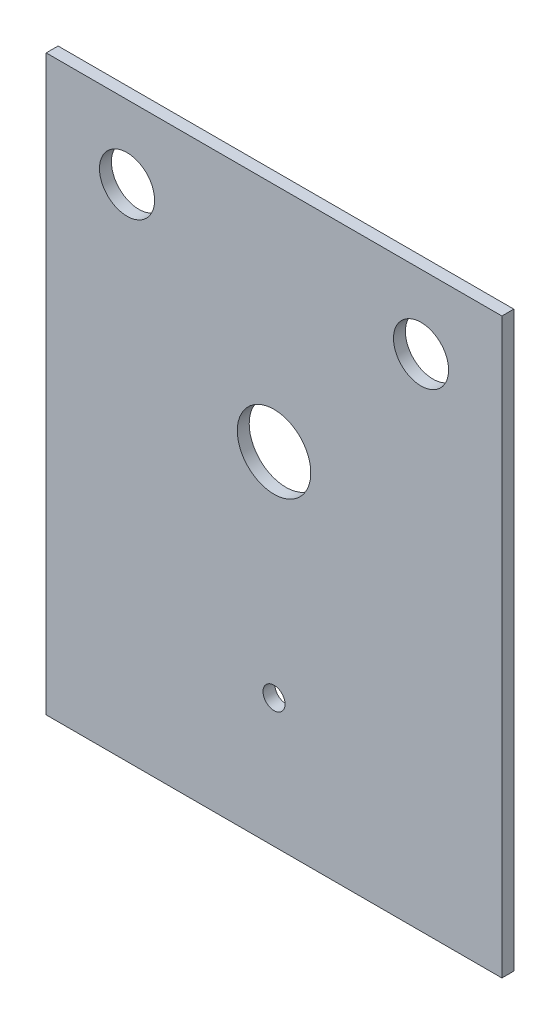
ISO-10303-21;
HEADER;
FILE_DESCRIPTION(('STEP AP214'),'2;1');
FILE_NAME('part.step','',(''),(''),'','','');
FILE_SCHEMA(('AUTOMOTIVE_DESIGN { 1 0 10303 214 1 1 1 1 }'));
ENDSEC;
DATA;
#1=APPLICATION_CONTEXT('core data for automotive mechanical design processes');
#2=APPLICATION_PROTOCOL_DEFINITION('international standard','automotive_design',2000,#1);
#3=PRODUCT_CONTEXT('',#1,'mechanical');
#4=PRODUCT('Part','Part','',(#3));
#5=PRODUCT_RELATED_PRODUCT_CATEGORY('part','',(#4));
#6=PRODUCT_DEFINITION_FORMATION('','',#4);
#7=PRODUCT_DEFINITION_CONTEXT('part definition',#1,'design');
#8=PRODUCT_DEFINITION('design','',#6,#7);
#9=PRODUCT_DEFINITION_SHAPE('','',#8);
#10=(LENGTH_UNIT() NAMED_UNIT(*) SI_UNIT(.MILLI.,.METRE.));
#11=(NAMED_UNIT(*) PLANE_ANGLE_UNIT() SI_UNIT($,.RADIAN.));
#12=(NAMED_UNIT(*) SI_UNIT($,.STERADIAN.) SOLID_ANGLE_UNIT());
#13=UNCERTAINTY_MEASURE_WITH_UNIT(LENGTH_MEASURE(1.E-05),#10,'distance_accuracy_value','');
#14=(GEOMETRIC_REPRESENTATION_CONTEXT(3) GLOBAL_UNCERTAINTY_ASSIGNED_CONTEXT((#13)) GLOBAL_UNIT_ASSIGNED_CONTEXT((#10,
#11,#12)) REPRESENTATION_CONTEXT('',''));
#15=CARTESIAN_POINT('',(0.,0.,0.));
#16=DIRECTION('',(0.,0.,1.));
#17=DIRECTION('',(1.,0.,0.));
#18=AXIS2_PLACEMENT_3D('',#15,#16,#17);
#19=CARTESIAN_POINT('',(88.646,64.008,0.41148));
#20=DIRECTION('',(-1.,0.,0.));
#21=DIRECTION('',(0.,0.,1.));
#22=AXIS2_PLACEMENT_3D('',#19,#20,#21);
#23=PLANE('',#22);
#24=DIRECTION('',(0.,1.,0.));
#25=VECTOR('',#24,1.);
#26=CARTESIAN_POINT('',(88.646,64.008,0.));
#27=LINE('',#26,#25);
#28=CARTESIAN_POINT('',(88.646,64.008,0.));
#29=VERTEX_POINT('',#28);
#30=CARTESIAN_POINT('',(88.646,83.82,0.));
#31=VERTEX_POINT('',#30);
#32=EDGE_CURVE('E102',#29,#31,#27,.T.);
#33=ORIENTED_EDGE('',*,*,#32,.F.);
#34=DIRECTION('',(0.,0.,-1.));
#35=VECTOR('',#34,1.);
#36=CARTESIAN_POINT('',(88.646,64.008,0.41148));
#37=LINE('',#36,#35);
#38=CARTESIAN_POINT('',(88.646,64.008,0.41148));
#39=VERTEX_POINT('',#38);
#40=EDGE_CURVE('E11',#39,#29,#37,.T.);
#41=ORIENTED_EDGE('',*,*,#40,.F.);
#42=DIRECTION('',(0.,1.,0.));
#43=VECTOR('',#42,1.);
#44=CARTESIAN_POINT('',(88.646,64.008,0.41148));
#45=LINE('',#44,#43);
#46=CARTESIAN_POINT('',(88.646,83.82,0.41148));
#47=VERTEX_POINT('',#46);
#48=EDGE_CURVE('E100',#39,#47,#45,.T.);
#49=ORIENTED_EDGE('',*,*,#48,.T.);
#50=DIRECTION('',(0.,0.,-1.));
#51=VECTOR('',#50,1.);
#52=CARTESIAN_POINT('',(88.646,83.82,0.41148));
#53=LINE('',#52,#51);
#54=EDGE_CURVE('E45',#47,#31,#53,.T.);
#55=ORIENTED_EDGE('',*,*,#54,.T.);
#56=EDGE_LOOP('',(#33,#41,#49,#55));
#57=FACE_BOUND('',#56,.T.);
#58=ADVANCED_FACE('F39',(#57),#23,.T.);
#59=CARTESIAN_POINT('',(104.394,64.008,0.41148));
#60=DIRECTION('',(0.,-1.,0.));
#61=DIRECTION('',(0.,0.,-1.));
#62=AXIS2_PLACEMENT_3D('',#59,#60,#61);
#63=PLANE('',#62);
#64=DIRECTION('',(-1.,0.,0.));
#65=VECTOR('',#64,1.);
#66=CARTESIAN_POINT('',(104.394,64.008,0.));
#67=LINE('',#66,#65);
#68=CARTESIAN_POINT('',(104.394,64.008,0.));
#69=VERTEX_POINT('',#68);
#70=EDGE_CURVE('E97',#69,#29,#67,.T.);
#71=ORIENTED_EDGE('',*,*,#70,.F.);
#72=DIRECTION('',(0.,0.,-1.));
#73=VECTOR('',#72,1.);
#74=CARTESIAN_POINT('',(104.394,64.008,0.41148));
#75=LINE('',#74,#73);
#76=CARTESIAN_POINT('',(104.394,64.008,0.41148));
#77=VERTEX_POINT('',#76);
#78=EDGE_CURVE('E48',#77,#69,#75,.T.);
#79=ORIENTED_EDGE('',*,*,#78,.F.);
#80=DIRECTION('',(-1.,0.,0.));
#81=VECTOR('',#80,1.);
#82=CARTESIAN_POINT('',(104.394,64.008,0.41148));
#83=LINE('',#82,#81);
#84=EDGE_CURVE('E94',#77,#39,#83,.T.);
#85=ORIENTED_EDGE('',*,*,#84,.T.);
#86=ORIENTED_EDGE('',*,*,#40,.T.);
#87=EDGE_LOOP('',(#71,#79,#85,#86));
#88=FACE_BOUND('',#87,.T.);
#89=ADVANCED_FACE('F113',(#88),#63,.T.);
#90=CARTESIAN_POINT('',(104.394,83.82,0.41148));
#91=DIRECTION('',(1.,0.,0.));
#92=DIRECTION('',(0.,0.,-1.));
#93=AXIS2_PLACEMENT_3D('',#90,#91,#92);
#94=PLANE('',#93);
#95=DIRECTION('',(0.,-1.,0.));
#96=VECTOR('',#95,1.);
#97=CARTESIAN_POINT('',(104.394,83.82,0.));
#98=LINE('',#97,#96);
#99=CARTESIAN_POINT('',(104.394,83.82,0.));
#100=VERTEX_POINT('',#99);
#101=EDGE_CURVE('E90',#100,#69,#98,.T.);
#102=ORIENTED_EDGE('',*,*,#101,.F.);
#103=DIRECTION('',(0.,0.,-1.));
#104=VECTOR('',#103,1.);
#105=CARTESIAN_POINT('',(104.394,83.82,0.41148));
#106=LINE('',#105,#104);
#107=CARTESIAN_POINT('',(104.394,83.82,0.41148));
#108=VERTEX_POINT('',#107);
#109=EDGE_CURVE('E83',#108,#100,#106,.T.);
#110=ORIENTED_EDGE('',*,*,#109,.F.);
#111=DIRECTION('',(0.,-1.,0.));
#112=VECTOR('',#111,1.);
#113=CARTESIAN_POINT('',(104.394,83.82,0.41148));
#114=LINE('',#113,#112);
#115=EDGE_CURVE('E87',#108,#77,#114,.T.);
#116=ORIENTED_EDGE('',*,*,#115,.T.);
#117=ORIENTED_EDGE('',*,*,#78,.T.);
#118=EDGE_LOOP('',(#102,#110,#116,#117));
#119=FACE_BOUND('',#118,.T.);
#120=ADVANCED_FACE('F88',(#119),#94,.T.);
#121=CARTESIAN_POINT('',(88.646,83.82,0.41148));
#122=DIRECTION('',(0.,1.,0.));
#123=DIRECTION('',(0.,0.,1.));
#124=AXIS2_PLACEMENT_3D('',#121,#122,#123);
#125=PLANE('',#124);
#126=DIRECTION('',(1.,0.,0.));
#127=VECTOR('',#126,1.);
#128=CARTESIAN_POINT('',(88.646,83.82,0.));
#129=LINE('',#128,#127);
#130=EDGE_CURVE('E110',#31,#100,#129,.T.);
#131=ORIENTED_EDGE('',*,*,#130,.F.);
#132=ORIENTED_EDGE('',*,*,#54,.F.);
#133=DIRECTION('',(1.,0.,0.));
#134=VECTOR('',#133,1.);
#135=CARTESIAN_POINT('',(88.646,83.82,0.41148));
#136=LINE('',#135,#134);
#137=EDGE_CURVE('E91',#47,#108,#136,.T.);
#138=ORIENTED_EDGE('',*,*,#137,.T.);
#139=ORIENTED_EDGE('',*,*,#109,.T.);
#140=EDGE_LOOP('',(#131,#132,#138,#139));
#141=FACE_BOUND('',#140,.T.);
#142=ADVANCED_FACE('F96',(#141),#125,.T.);
#143=CARTESIAN_POINT('',(0.,0.,0.41148));
#144=DIRECTION('',(0.,0.,-1.));
#145=DIRECTION('',(-1.,0.,0.));
#146=AXIS2_PLACEMENT_3D('',#143,#144,#145);
#147=PLANE('',#146);
#148=CARTESIAN_POINT('',(101.6,81.28,0.41148));
#149=DIRECTION('',(0.,0.,-1.));
#150=DIRECTION('',(1.,0.,0.));
#151=AXIS2_PLACEMENT_3D('',#148,#149,#150);
#152=CIRCLE('',#151,0.951999999999995);
#153=CARTESIAN_POINT('',(100.648,81.28,0.41148));
#154=VERTEX_POINT('',#153);
#155=EDGE_CURVE('E156',#154,#154,#152,.T.);
#156=ORIENTED_EDGE('',*,*,#155,.T.);
#157=EDGE_LOOP('',(#156));
#158=FACE_BOUND('',#157,.T.);
#159=CARTESIAN_POINT('',(96.52,68.453,0.41148));
#160=DIRECTION('',(0.,0.,-1.));
#161=DIRECTION('',(1.,0.,0.));
#162=AXIS2_PLACEMENT_3D('',#159,#160,#161);
#163=CIRCLE('',#162,0.381000000000006);
#164=CARTESIAN_POINT('',(96.901,68.453,0.41148));
#165=VERTEX_POINT('',#164);
#166=EDGE_CURVE('E163',#165,#165,#163,.T.);
#167=ORIENTED_EDGE('',*,*,#166,.T.);
#168=EDGE_LOOP('',(#167));
#169=FACE_BOUND('',#168,.T.);
#170=CARTESIAN_POINT('',(91.44,81.28,0.41148));
#171=DIRECTION('',(0.,0.,-1.));
#172=DIRECTION('',(1.,0.,0.));
#173=AXIS2_PLACEMENT_3D('',#170,#171,#172);
#174=CIRCLE('',#173,0.951999999999995);
#175=CARTESIAN_POINT('',(90.488,81.28,0.41148));
#176=VERTEX_POINT('',#175);
#177=EDGE_CURVE('E168',#176,#176,#174,.T.);
#178=ORIENTED_EDGE('',*,*,#177,.T.);
#179=EDGE_LOOP('',(#178));
#180=FACE_BOUND('',#179,.T.);
#181=CARTESIAN_POINT('',(96.52,75.819,0.41148));
#182=DIRECTION('',(0.,0.,-1.));
#183=DIRECTION('',(1.,0.,0.));
#184=AXIS2_PLACEMENT_3D('',#181,#182,#183);
#185=CIRCLE('',#184,1.26999999999999);
#186=CARTESIAN_POINT('',(95.25,75.819,0.41148));
#187=VERTEX_POINT('',#186);
#188=EDGE_CURVE('E107',#187,#187,#185,.T.);
#189=ORIENTED_EDGE('',*,*,#188,.T.);
#190=EDGE_LOOP('',(#189));
#191=FACE_BOUND('',#190,.T.);
#192=ORIENTED_EDGE('',*,*,#48,.F.);
#193=ORIENTED_EDGE('',*,*,#84,.F.);
#194=ORIENTED_EDGE('',*,*,#115,.F.);
#195=ORIENTED_EDGE('',*,*,#137,.F.);
#196=EDGE_LOOP('',(#192,#193,#194,#195));
#197=FACE_BOUND('',#196,.T.);
#198=ADVANCED_FACE('F95',(#158,#169,#180,#191,#197),#147,.F.);
#199=CARTESIAN_POINT('',(0.,0.,0.));
#200=DIRECTION('',(0.,0.,-1.));
#201=DIRECTION('',(-1.,0.,0.));
#202=AXIS2_PLACEMENT_3D('',#199,#200,#201);
#203=PLANE('',#202);
#204=CARTESIAN_POINT('',(101.6,81.28,0.));
#205=DIRECTION('',(0.,0.,-1.));
#206=DIRECTION('',(1.,0.,0.));
#207=AXIS2_PLACEMENT_3D('',#204,#205,#206);
#208=CIRCLE('',#207,0.951999999999995);
#209=CARTESIAN_POINT('',(100.648,81.28,0.));
#210=VERTEX_POINT('',#209);
#211=EDGE_CURVE('E157',#210,#210,#208,.T.);
#212=ORIENTED_EDGE('',*,*,#211,.F.);
#213=EDGE_LOOP('',(#212));
#214=FACE_BOUND('',#213,.T.);
#215=CARTESIAN_POINT('',(96.52,68.453,0.));
#216=DIRECTION('',(0.,0.,-1.));
#217=DIRECTION('',(1.,0.,0.));
#218=AXIS2_PLACEMENT_3D('',#215,#216,#217);
#219=CIRCLE('',#218,0.381000000000006);
#220=CARTESIAN_POINT('',(96.901,68.453,0.));
#221=VERTEX_POINT('',#220);
#222=EDGE_CURVE('E161',#221,#221,#219,.T.);
#223=ORIENTED_EDGE('',*,*,#222,.F.);
#224=EDGE_LOOP('',(#223));
#225=FACE_BOUND('',#224,.T.);
#226=CARTESIAN_POINT('',(91.44,81.28,0.));
#227=DIRECTION('',(0.,0.,-1.));
#228=DIRECTION('',(1.,0.,0.));
#229=AXIS2_PLACEMENT_3D('',#226,#227,#228);
#230=CIRCLE('',#229,0.951999999999995);
#231=CARTESIAN_POINT('',(90.488,81.28,0.));
#232=VERTEX_POINT('',#231);
#233=EDGE_CURVE('E170',#232,#232,#230,.T.);
#234=ORIENTED_EDGE('',*,*,#233,.F.);
#235=EDGE_LOOP('',(#234));
#236=FACE_BOUND('',#235,.T.);
#237=CARTESIAN_POINT('',(96.52,75.819,0.));
#238=DIRECTION('',(0.,0.,-1.));
#239=DIRECTION('',(1.,0.,0.));
#240=AXIS2_PLACEMENT_3D('',#237,#238,#239);
#241=CIRCLE('',#240,1.26999999999999);
#242=CARTESIAN_POINT('',(95.25,75.819,0.));
#243=VERTEX_POINT('',#242);
#244=EDGE_CURVE('E174',#243,#243,#241,.T.);
#245=ORIENTED_EDGE('',*,*,#244,.F.);
#246=EDGE_LOOP('',(#245));
#247=FACE_BOUND('',#246,.T.);
#248=ORIENTED_EDGE('',*,*,#32,.T.);
#249=ORIENTED_EDGE('',*,*,#130,.T.);
#250=ORIENTED_EDGE('',*,*,#101,.T.);
#251=ORIENTED_EDGE('',*,*,#70,.T.);
#252=EDGE_LOOP('',(#248,#249,#250,#251));
#253=FACE_BOUND('',#252,.T.);
#254=ADVANCED_FACE('F111',(#214,#225,#236,#247,#253),#203,.T.);
#255=CARTESIAN_POINT('',(96.52,75.819,0.41148));
#256=DIRECTION('',(0.,0.,-1.));
#257=DIRECTION('',(-1.,0.,0.));
#258=AXIS2_PLACEMENT_3D('',#255,#256,#257);
#259=CYLINDRICAL_SURFACE('',#258,1.26999999999999);
#260=CARTESIAN_POINT('',(95.25,75.819,0.41148));
#261=CARTESIAN_POINT('',(95.25,75.819,0.40719375));
#262=CARTESIAN_POINT('',(95.25,75.819,0.4029075));
#263=CARTESIAN_POINT('',(95.25,75.819,0.394335));
#264=CARTESIAN_POINT('',(95.25,75.819,0.39004875));
#265=CARTESIAN_POINT('',(95.25,75.819,0.38147625));
#266=CARTESIAN_POINT('',(95.25,75.819,0.37719));
#267=CARTESIAN_POINT('',(95.25,75.819,0.3686175));
#268=CARTESIAN_POINT('',(95.25,75.819,0.36433125));
#269=CARTESIAN_POINT('',(95.25,75.819,0.35575875));
#270=CARTESIAN_POINT('',(95.25,75.819,0.3514725));
#271=CARTESIAN_POINT('',(95.25,75.819,0.3429));
#272=CARTESIAN_POINT('',(95.25,75.819,0.33861375));
#273=CARTESIAN_POINT('',(95.25,75.819,0.33004125));
#274=CARTESIAN_POINT('',(95.25,75.819,0.325755));
#275=CARTESIAN_POINT('',(95.25,75.819,0.3171825));
#276=CARTESIAN_POINT('',(95.25,75.819,0.31289625));
#277=CARTESIAN_POINT('',(95.25,75.819,0.30432375));
#278=CARTESIAN_POINT('',(95.25,75.819,0.3000375));
#279=CARTESIAN_POINT('',(95.25,75.819,0.291465));
#280=CARTESIAN_POINT('',(95.25,75.819,0.28717875));
#281=CARTESIAN_POINT('',(95.25,75.819,0.27860625));
#282=CARTESIAN_POINT('',(95.25,75.819,0.27432));
#283=CARTESIAN_POINT('',(95.25,75.819,0.2657475));
#284=CARTESIAN_POINT('',(95.25,75.819,0.26146125));
#285=CARTESIAN_POINT('',(95.25,75.819,0.25288875));
#286=CARTESIAN_POINT('',(95.25,75.819,0.2486025));
#287=CARTESIAN_POINT('',(95.25,75.819,0.24003));
#288=CARTESIAN_POINT('',(95.25,75.819,0.23574375));
#289=CARTESIAN_POINT('',(95.25,75.819,0.22717125));
#290=CARTESIAN_POINT('',(95.25,75.819,0.222885));
#291=CARTESIAN_POINT('',(95.25,75.819,0.2143125));
#292=CARTESIAN_POINT('',(95.25,75.819,0.21002625));
#293=CARTESIAN_POINT('',(95.25,75.819,0.20145375));
#294=CARTESIAN_POINT('',(95.25,75.819,0.1971675));
#295=CARTESIAN_POINT('',(95.25,75.819,0.188595));
#296=CARTESIAN_POINT('',(95.25,75.819,0.18430875));
#297=CARTESIAN_POINT('',(95.25,75.819,0.17573625));
#298=CARTESIAN_POINT('',(95.25,75.819,0.17145));
#299=CARTESIAN_POINT('',(95.25,75.819,0.1628775));
#300=CARTESIAN_POINT('',(95.25,75.819,0.15859125));
#301=CARTESIAN_POINT('',(95.25,75.819,0.15001875));
#302=CARTESIAN_POINT('',(95.25,75.819,0.1457325));
#303=CARTESIAN_POINT('',(95.25,75.819,0.13716));
#304=CARTESIAN_POINT('',(95.25,75.819,0.13287375));
#305=CARTESIAN_POINT('',(95.25,75.819,0.12430125));
#306=CARTESIAN_POINT('',(95.25,75.819,0.120015));
#307=CARTESIAN_POINT('',(95.25,75.819,0.1114425));
#308=CARTESIAN_POINT('',(95.25,75.819,0.10715625));
#309=CARTESIAN_POINT('',(95.25,75.819,0.0985837500000001));
#310=CARTESIAN_POINT('',(95.25,75.819,0.0942975000000001));
#311=CARTESIAN_POINT('',(95.25,75.819,0.0857250000000001));
#312=CARTESIAN_POINT('',(95.25,75.819,0.0814387500000001));
#313=CARTESIAN_POINT('',(95.25,75.819,0.0728662500000001));
#314=CARTESIAN_POINT('',(95.25,75.819,0.0685800000000001));
#315=CARTESIAN_POINT('',(95.25,75.819,0.0600075000000001));
#316=CARTESIAN_POINT('',(95.25,75.819,0.0557212500000001));
#317=CARTESIAN_POINT('',(95.25,75.819,0.0471487500000001));
#318=CARTESIAN_POINT('',(95.25,75.819,0.0428625000000001));
#319=CARTESIAN_POINT('',(95.25,75.819,0.0342900000000001));
#320=CARTESIAN_POINT('',(95.25,75.819,0.0300037500000001));
#321=CARTESIAN_POINT('',(95.25,75.819,0.0214312500000001));
#322=CARTESIAN_POINT('',(95.25,75.819,0.0171450000000001));
#323=CARTESIAN_POINT('',(95.25,75.819,0.00857250000000007));
#324=CARTESIAN_POINT('',(95.25,75.819,0.00428625000000007));
#325=CARTESIAN_POINT('',(95.25,75.819,0.));
#326=B_SPLINE_CURVE_WITH_KNOTS('',3,(#260,#261,#262,#263,#264,#265,#266,#267,#268,#269,#270,
#271,#272,#273,#274,#275,#276,#277,#278,#279,#280,#281,#282,#283,#284,#285,#286,#287,#288,#289,
#290,#291,#292,#293,#294,#295,#296,#297,#298,#299,#300,#301,#302,#303,#304,#305,#306,#307,#308,
#309,#310,#311,#312,#313,#314,#315,#316,#317,#318,#319,#320,#321,#322,#323,#324,#325),
.UNSPECIFIED.,.F.,.F.,(4,2,2,2,2,2,2,2,2,2,2,2,2,2,2,2,2,2,2,2,2,2,2,2,2,2,2,2,2,2,2,2,4),(0.,
0.01285875,0.0257175,0.03857625,0.051435,0.06429375,0.0771525,0.0900112500000001,0.10287,
0.11572875,0.1285875,0.14144625,0.154305,0.16716375,0.1800225,0.19288125,0.20574,0.21859875,
0.2314575,0.24431625,0.257175,0.27003375,0.2828925,0.29575125,0.30861,0.32146875,0.3343275,
0.34718625,0.360045,0.37290375,0.3857625,0.39862125,0.41148),.UNSPECIFIED.);
#327=EDGE_CURVE('BSEAM134',#187,#243,#326,.T.);
#328=ORIENTED_EDGE('',*,*,#188,.F.);
#329=ORIENTED_EDGE('',*,*,#244,.T.);
#330=ORIENTED_EDGE('',*,*,#327,.T.);
#331=ORIENTED_EDGE('',*,*,#327,.F.);
#332=EDGE_LOOP('',(#328,#330,#329,#331));
#333=FACE_BOUND('',#332,.T.);
#334=ADVANCED_FACE('F134',(#333),#259,.F.);
#335=CARTESIAN_POINT('',(91.44,81.28,0.41148));
#336=DIRECTION('',(0.,0.,-1.));
#337=DIRECTION('',(-1.,0.,0.));
#338=AXIS2_PLACEMENT_3D('',#335,#336,#337);
#339=CYLINDRICAL_SURFACE('',#338,0.951999999999995);
#340=CARTESIAN_POINT('',(90.488,81.28,0.41148));
#341=CARTESIAN_POINT('',(90.488,81.28,0.40719375));
#342=CARTESIAN_POINT('',(90.488,81.28,0.4029075));
#343=CARTESIAN_POINT('',(90.488,81.28,0.394335));
#344=CARTESIAN_POINT('',(90.488,81.28,0.39004875));
#345=CARTESIAN_POINT('',(90.488,81.28,0.38147625));
#346=CARTESIAN_POINT('',(90.488,81.28,0.37719));
#347=CARTESIAN_POINT('',(90.488,81.28,0.3686175));
#348=CARTESIAN_POINT('',(90.488,81.28,0.36433125));
#349=CARTESIAN_POINT('',(90.488,81.28,0.35575875));
#350=CARTESIAN_POINT('',(90.488,81.28,0.3514725));
#351=CARTESIAN_POINT('',(90.488,81.28,0.3429));
#352=CARTESIAN_POINT('',(90.488,81.28,0.33861375));
#353=CARTESIAN_POINT('',(90.488,81.28,0.33004125));
#354=CARTESIAN_POINT('',(90.488,81.28,0.325755));
#355=CARTESIAN_POINT('',(90.488,81.28,0.3171825));
#356=CARTESIAN_POINT('',(90.488,81.28,0.31289625));
#357=CARTESIAN_POINT('',(90.488,81.28,0.30432375));
#358=CARTESIAN_POINT('',(90.488,81.28,0.3000375));
#359=CARTESIAN_POINT('',(90.488,81.28,0.291465));
#360=CARTESIAN_POINT('',(90.488,81.28,0.28717875));
#361=CARTESIAN_POINT('',(90.488,81.28,0.27860625));
#362=CARTESIAN_POINT('',(90.488,81.28,0.27432));
#363=CARTESIAN_POINT('',(90.488,81.28,0.2657475));
#364=CARTESIAN_POINT('',(90.488,81.28,0.26146125));
#365=CARTESIAN_POINT('',(90.488,81.28,0.25288875));
#366=CARTESIAN_POINT('',(90.488,81.28,0.2486025));
#367=CARTESIAN_POINT('',(90.488,81.28,0.24003));
#368=CARTESIAN_POINT('',(90.488,81.28,0.23574375));
#369=CARTESIAN_POINT('',(90.488,81.28,0.22717125));
#370=CARTESIAN_POINT('',(90.488,81.28,0.222885));
#371=CARTESIAN_POINT('',(90.488,81.28,0.2143125));
#372=CARTESIAN_POINT('',(90.488,81.28,0.21002625));
#373=CARTESIAN_POINT('',(90.488,81.28,0.20145375));
#374=CARTESIAN_POINT('',(90.488,81.28,0.1971675));
#375=CARTESIAN_POINT('',(90.488,81.28,0.188595));
#376=CARTESIAN_POINT('',(90.488,81.28,0.18430875));
#377=CARTESIAN_POINT('',(90.488,81.28,0.17573625));
#378=CARTESIAN_POINT('',(90.488,81.28,0.17145));
#379=CARTESIAN_POINT('',(90.488,81.28,0.1628775));
#380=CARTESIAN_POINT('',(90.488,81.28,0.15859125));
#381=CARTESIAN_POINT('',(90.488,81.28,0.15001875));
#382=CARTESIAN_POINT('',(90.488,81.28,0.1457325));
#383=CARTESIAN_POINT('',(90.488,81.28,0.13716));
#384=CARTESIAN_POINT('',(90.488,81.28,0.13287375));
#385=CARTESIAN_POINT('',(90.488,81.28,0.12430125));
#386=CARTESIAN_POINT('',(90.488,81.28,0.120015));
#387=CARTESIAN_POINT('',(90.488,81.28,0.1114425));
#388=CARTESIAN_POINT('',(90.488,81.28,0.10715625));
#389=CARTESIAN_POINT('',(90.488,81.28,0.0985837500000001));
#390=CARTESIAN_POINT('',(90.488,81.28,0.0942975000000001));
#391=CARTESIAN_POINT('',(90.488,81.28,0.0857250000000001));
#392=CARTESIAN_POINT('',(90.488,81.28,0.0814387500000001));
#393=CARTESIAN_POINT('',(90.488,81.28,0.0728662500000001));
#394=CARTESIAN_POINT('',(90.488,81.28,0.0685800000000001));
#395=CARTESIAN_POINT('',(90.488,81.28,0.0600075000000001));
#396=CARTESIAN_POINT('',(90.488,81.28,0.0557212500000001));
#397=CARTESIAN_POINT('',(90.488,81.28,0.0471487500000001));
#398=CARTESIAN_POINT('',(90.488,81.28,0.0428625000000001));
#399=CARTESIAN_POINT('',(90.488,81.28,0.0342900000000001));
#400=CARTESIAN_POINT('',(90.488,81.28,0.0300037500000001));
#401=CARTESIAN_POINT('',(90.488,81.28,0.0214312500000001));
#402=CARTESIAN_POINT('',(90.488,81.28,0.0171450000000001));
#403=CARTESIAN_POINT('',(90.488,81.28,0.00857250000000007));
#404=CARTESIAN_POINT('',(90.488,81.28,0.00428625000000007));
#405=CARTESIAN_POINT('',(90.488,81.28,0.));
#406=B_SPLINE_CURVE_WITH_KNOTS('',3,(#340,#341,#342,#343,#344,#345,#346,#347,#348,#349,#350,
#351,#352,#353,#354,#355,#356,#357,#358,#359,#360,#361,#362,#363,#364,#365,#366,#367,#368,#369,
#370,#371,#372,#373,#374,#375,#376,#377,#378,#379,#380,#381,#382,#383,#384,#385,#386,#387,#388,
#389,#390,#391,#392,#393,#394,#395,#396,#397,#398,#399,#400,#401,#402,#403,#404,#405),
.UNSPECIFIED.,.F.,.F.,(4,2,2,2,2,2,2,2,2,2,2,2,2,2,2,2,2,2,2,2,2,2,2,2,2,2,2,2,2,2,2,2,4),(0.,
0.01285875,0.0257175,0.03857625,0.051435,0.06429375,0.0771525,0.09001125,0.10287,0.11572875,
0.1285875,0.14144625,0.154305,0.16716375,0.1800225,0.19288125,0.20574,0.21859875,0.2314575,
0.24431625,0.257175,0.27003375,0.2828925,0.29575125,0.30861,0.32146875,0.3343275,0.34718625,
0.360045,0.37290375,0.3857625,0.39862125,0.41148),.UNSPECIFIED.);
#407=EDGE_CURVE('BSEAM140',#176,#232,#406,.T.);
#408=ORIENTED_EDGE('',*,*,#177,.F.);
#409=ORIENTED_EDGE('',*,*,#233,.T.);
#410=ORIENTED_EDGE('',*,*,#407,.T.);
#411=ORIENTED_EDGE('',*,*,#407,.F.);
#412=EDGE_LOOP('',(#408,#410,#409,#411));
#413=FACE_BOUND('',#412,.T.);
#414=ADVANCED_FACE('F140',(#413),#339,.F.);
#415=CARTESIAN_POINT('',(96.52,68.453,0.41148));
#416=DIRECTION('',(0.,0.,-1.));
#417=DIRECTION('',(-1.,0.,0.));
#418=AXIS2_PLACEMENT_3D('',#415,#416,#417);
#419=CYLINDRICAL_SURFACE('',#418,0.381000000000006);
#420=ORIENTED_EDGE('',*,*,#166,.F.);
#421=EDGE_LOOP('',(#420));
#422=FACE_BOUND('',#421,.T.);
#423=ORIENTED_EDGE('',*,*,#222,.T.);
#424=EDGE_LOOP('',(#423));
#425=FACE_BOUND('',#424,.T.);
#426=ADVANCED_FACE('F145',(#422,#425),#419,.F.);
#427=CARTESIAN_POINT('',(101.6,81.28,0.41148));
#428=DIRECTION('',(0.,0.,-1.));
#429=DIRECTION('',(-1.,0.,0.));
#430=AXIS2_PLACEMENT_3D('',#427,#428,#429);
#431=CYLINDRICAL_SURFACE('',#430,0.951999999999995);
#432=CARTESIAN_POINT('',(100.648,81.28,0.41148));
#433=CARTESIAN_POINT('',(100.648,81.28,0.40719375));
#434=CARTESIAN_POINT('',(100.648,81.28,0.4029075));
#435=CARTESIAN_POINT('',(100.648,81.28,0.394335));
#436=CARTESIAN_POINT('',(100.648,81.28,0.39004875));
#437=CARTESIAN_POINT('',(100.648,81.28,0.38147625));
#438=CARTESIAN_POINT('',(100.648,81.28,0.37719));
#439=CARTESIAN_POINT('',(100.648,81.28,0.3686175));
#440=CARTESIAN_POINT('',(100.648,81.28,0.36433125));
#441=CARTESIAN_POINT('',(100.648,81.28,0.35575875));
#442=CARTESIAN_POINT('',(100.648,81.28,0.3514725));
#443=CARTESIAN_POINT('',(100.648,81.28,0.3429));
#444=CARTESIAN_POINT('',(100.648,81.28,0.33861375));
#445=CARTESIAN_POINT('',(100.648,81.28,0.33004125));
#446=CARTESIAN_POINT('',(100.648,81.28,0.325755));
#447=CARTESIAN_POINT('',(100.648,81.28,0.3171825));
#448=CARTESIAN_POINT('',(100.648,81.28,0.31289625));
#449=CARTESIAN_POINT('',(100.648,81.28,0.30432375));
#450=CARTESIAN_POINT('',(100.648,81.28,0.3000375));
#451=CARTESIAN_POINT('',(100.648,81.28,0.291465));
#452=CARTESIAN_POINT('',(100.648,81.28,0.28717875));
#453=CARTESIAN_POINT('',(100.648,81.28,0.27860625));
#454=CARTESIAN_POINT('',(100.648,81.28,0.27432));
#455=CARTESIAN_POINT('',(100.648,81.28,0.2657475));
#456=CARTESIAN_POINT('',(100.648,81.28,0.26146125));
#457=CARTESIAN_POINT('',(100.648,81.28,0.25288875));
#458=CARTESIAN_POINT('',(100.648,81.28,0.2486025));
#459=CARTESIAN_POINT('',(100.648,81.28,0.24003));
#460=CARTESIAN_POINT('',(100.648,81.28,0.23574375));
#461=CARTESIAN_POINT('',(100.648,81.28,0.22717125));
#462=CARTESIAN_POINT('',(100.648,81.28,0.222885));
#463=CARTESIAN_POINT('',(100.648,81.28,0.2143125));
#464=CARTESIAN_POINT('',(100.648,81.28,0.21002625));
#465=CARTESIAN_POINT('',(100.648,81.28,0.20145375));
#466=CARTESIAN_POINT('',(100.648,81.28,0.1971675));
#467=CARTESIAN_POINT('',(100.648,81.28,0.188595));
#468=CARTESIAN_POINT('',(100.648,81.28,0.18430875));
#469=CARTESIAN_POINT('',(100.648,81.28,0.17573625));
#470=CARTESIAN_POINT('',(100.648,81.28,0.17145));
#471=CARTESIAN_POINT('',(100.648,81.28,0.1628775));
#472=CARTESIAN_POINT('',(100.648,81.28,0.15859125));
#473=CARTESIAN_POINT('',(100.648,81.28,0.15001875));
#474=CARTESIAN_POINT('',(100.648,81.28,0.1457325));
#475=CARTESIAN_POINT('',(100.648,81.28,0.13716));
#476=CARTESIAN_POINT('',(100.648,81.28,0.13287375));
#477=CARTESIAN_POINT('',(100.648,81.28,0.12430125));
#478=CARTESIAN_POINT('',(100.648,81.28,0.120015));
#479=CARTESIAN_POINT('',(100.648,81.28,0.1114425));
#480=CARTESIAN_POINT('',(100.648,81.28,0.10715625));
#481=CARTESIAN_POINT('',(100.648,81.28,0.0985837500000001));
#482=CARTESIAN_POINT('',(100.648,81.28,0.0942975000000001));
#483=CARTESIAN_POINT('',(100.648,81.28,0.0857250000000001));
#484=CARTESIAN_POINT('',(100.648,81.28,0.0814387500000001));
#485=CARTESIAN_POINT('',(100.648,81.28,0.0728662500000001));
#486=CARTESIAN_POINT('',(100.648,81.28,0.0685800000000001));
#487=CARTESIAN_POINT('',(100.648,81.28,0.0600075000000001));
#488=CARTESIAN_POINT('',(100.648,81.28,0.0557212500000001));
#489=CARTESIAN_POINT('',(100.648,81.28,0.0471487500000001));
#490=CARTESIAN_POINT('',(100.648,81.28,0.0428625000000001));
#491=CARTESIAN_POINT('',(100.648,81.28,0.0342900000000001));
#492=CARTESIAN_POINT('',(100.648,81.28,0.0300037500000001));
#493=CARTESIAN_POINT('',(100.648,81.28,0.0214312500000001));
#494=CARTESIAN_POINT('',(100.648,81.28,0.0171450000000001));
#495=CARTESIAN_POINT('',(100.648,81.28,0.00857250000000007));
#496=CARTESIAN_POINT('',(100.648,81.28,0.00428625000000007));
#497=CARTESIAN_POINT('',(100.648,81.28,0.));
#498=B_SPLINE_CURVE_WITH_KNOTS('',3,(#432,#433,#434,#435,#436,#437,#438,#439,#440,#441,#442,
#443,#444,#445,#446,#447,#448,#449,#450,#451,#452,#453,#454,#455,#456,#457,#458,#459,#460,#461,
#462,#463,#464,#465,#466,#467,#468,#469,#470,#471,#472,#473,#474,#475,#476,#477,#478,#479,#480,
#481,#482,#483,#484,#485,#486,#487,#488,#489,#490,#491,#492,#493,#494,#495,#496,#497),
.UNSPECIFIED.,.F.,.F.,(4,2,2,2,2,2,2,2,2,2,2,2,2,2,2,2,2,2,2,2,2,2,2,2,2,2,2,2,2,2,2,2,4),(0.,
0.01285875,0.0257175,0.03857625,0.051435,0.06429375,0.0771525,0.09001125,0.10287,0.11572875,
0.1285875,0.14144625,0.154305,0.16716375,0.1800225,0.19288125,0.20574,0.21859875,0.2314575,
0.24431625,0.257175,0.27003375,0.2828925,0.29575125,0.30861,0.32146875,0.3343275,0.34718625,
0.360045,0.37290375,0.3857625,0.39862125,0.41148),.UNSPECIFIED.);
#499=EDGE_CURVE('BSEAM146',#154,#210,#498,.T.);
#500=ORIENTED_EDGE('',*,*,#155,.F.);
#501=ORIENTED_EDGE('',*,*,#211,.T.);
#502=ORIENTED_EDGE('',*,*,#499,.T.);
#503=ORIENTED_EDGE('',*,*,#499,.F.);
#504=EDGE_LOOP('',(#500,#502,#501,#503));
#505=FACE_BOUND('',#504,.T.);
#506=ADVANCED_FACE('F146',(#505),#431,.F.);
#507=CLOSED_SHELL('',(#58,#89,#120,#142,#198,#254,#334,#414,#426,#506));
#508=MANIFOLD_SOLID_BREP('B2',#507);
#509=ADVANCED_BREP_SHAPE_REPRESENTATION('',(#18,#508),#14);
#510=SHAPE_DEFINITION_REPRESENTATION(#9,#509);
ENDSEC;
END-ISO-10303-21;
